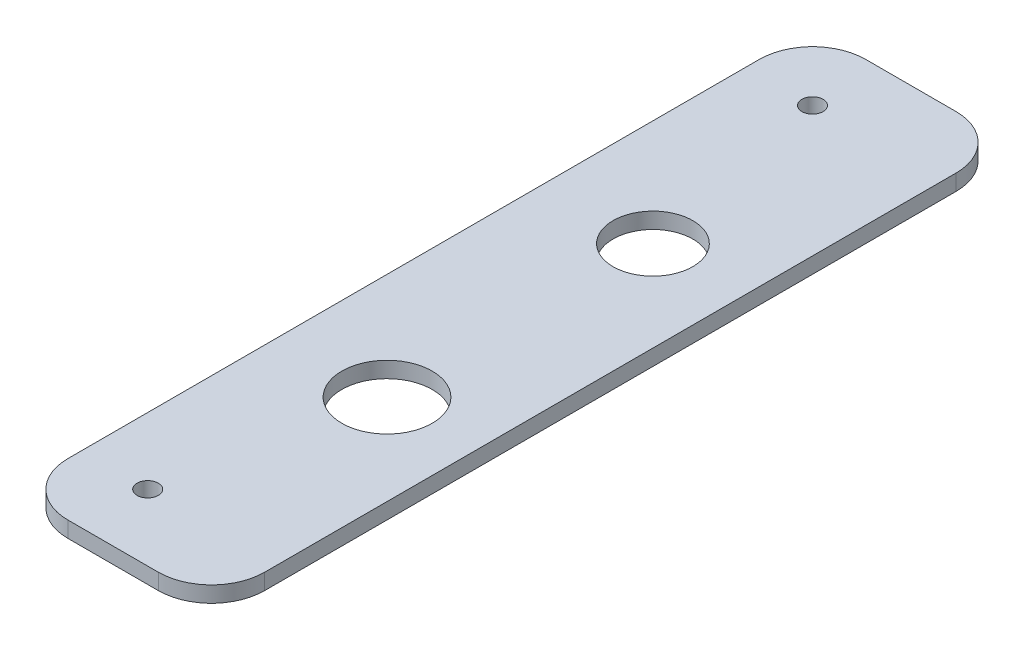
ISO-10303-21;
HEADER;
FILE_DESCRIPTION(('STEP AP214'),'2;1');
FILE_NAME('part.step','',(''),(''),'','','');
FILE_SCHEMA(('AUTOMOTIVE_DESIGN { 1 0 10303 214 1 1 1 1 }'));
ENDSEC;
DATA;
#1=APPLICATION_CONTEXT('core data for automotive mechanical design processes');
#2=APPLICATION_PROTOCOL_DEFINITION('international standard','automotive_design',2000,#1);
#3=PRODUCT_CONTEXT('',#1,'mechanical');
#4=PRODUCT('Part','Part','',(#3));
#5=PRODUCT_RELATED_PRODUCT_CATEGORY('part','',(#4));
#6=PRODUCT_DEFINITION_FORMATION('','',#4);
#7=PRODUCT_DEFINITION_CONTEXT('part definition',#1,'design');
#8=PRODUCT_DEFINITION('design','',#6,#7);
#9=PRODUCT_DEFINITION_SHAPE('','',#8);
#10=(LENGTH_UNIT() NAMED_UNIT(*) SI_UNIT(.MILLI.,.METRE.));
#11=(NAMED_UNIT(*) PLANE_ANGLE_UNIT() SI_UNIT($,.RADIAN.));
#12=(NAMED_UNIT(*) SI_UNIT($,.STERADIAN.) SOLID_ANGLE_UNIT());
#13=UNCERTAINTY_MEASURE_WITH_UNIT(LENGTH_MEASURE(1.E-05),#10,'distance_accuracy_value','');
#14=(GEOMETRIC_REPRESENTATION_CONTEXT(3) GLOBAL_UNCERTAINTY_ASSIGNED_CONTEXT((#13)) GLOBAL_UNIT_ASSIGNED_CONTEXT((#10,
#11,#12)) REPRESENTATION_CONTEXT('',''));
#15=CARTESIAN_POINT('',(0.,0.,0.));
#16=DIRECTION('',(0.,0.,1.));
#17=DIRECTION('',(1.,0.,0.));
#18=AXIS2_PLACEMENT_3D('',#15,#16,#17);
#19=CARTESIAN_POINT('',(0.,3.,0.));
#20=DIRECTION('',(0.,1.,0.));
#21=DIRECTION('',(0.,0.,1.));
#22=AXIS2_PLACEMENT_3D('',#19,#20,#21);
#23=PLANE('',#22);
#24=CARTESIAN_POINT('',(-6.00000000000001,3.,-62.5));
#25=DIRECTION('',(0.,1.,0.));
#26=DIRECTION('',(0.,0.,1.));
#27=AXIS2_PLACEMENT_3D('',#24,#25,#26);
#28=CIRCLE('',#27,2.);
#29=CARTESIAN_POINT('',(-6.00000000000001,3.,-60.5));
#30=VERTEX_POINT('',#29);
#31=EDGE_CURVE('E185',#30,#30,#28,.T.);
#32=ORIENTED_EDGE('',*,*,#31,.F.);
#33=EDGE_LOOP('',(#32));
#34=FACE_BOUND('',#33,.T.);
#35=CARTESIAN_POINT('',(-6.00000000000001,3.,62.5));
#36=DIRECTION('',(0.,1.,0.));
#37=DIRECTION('',(0.,0.,1.));
#38=AXIS2_PLACEMENT_3D('',#35,#36,#37);
#39=CIRCLE('',#38,2.);
#40=CARTESIAN_POINT('',(-6.00000000000001,3.,64.5));
#41=VERTEX_POINT('',#40);
#42=EDGE_CURVE('E193',#41,#41,#39,.T.);
#43=ORIENTED_EDGE('',*,*,#42,.F.);
#44=EDGE_LOOP('',(#43));
#45=FACE_BOUND('',#44,.T.);
#46=CARTESIAN_POINT('',(1.5,3.,-25.));
#47=DIRECTION('',(0.,1.,0.));
#48=DIRECTION('',(0.,0.,1.));
#49=AXIS2_PLACEMENT_3D('',#46,#47,#48);
#50=CIRCLE('',#49,7.5);
#51=CARTESIAN_POINT('',(1.5,3.,-17.5));
#52=VERTEX_POINT('',#51);
#53=EDGE_CURVE('E209',#52,#52,#50,.T.);
#54=ORIENTED_EDGE('',*,*,#53,.F.);
#55=EDGE_LOOP('',(#54));
#56=FACE_BOUND('',#55,.T.);
#57=DIRECTION('',(-1.,0.,0.));
#58=VECTOR('',#57,1.);
#59=CARTESIAN_POINT('',(-18.5,3.,-75.));
#60=LINE('',#59,#58);
#61=CARTESIAN_POINT('',(8.49999999999999,3.,-75.));
#62=VERTEX_POINT('',#61);
#63=CARTESIAN_POINT('',(-8.50000000000001,3.,-75.));
#64=VERTEX_POINT('',#63);
#65=EDGE_CURVE('E219',#62,#64,#60,.T.);
#66=ORIENTED_EDGE('',*,*,#65,.T.);
#67=CARTESIAN_POINT('',(-8.50000000000001,3.,-65.));
#68=DIRECTION('',(0.,1.,0.));
#69=DIRECTION('',(0.,0.,1.));
#70=AXIS2_PLACEMENT_3D('',#67,#68,#69);
#71=CIRCLE('',#70,10.);
#72=CARTESIAN_POINT('',(-18.5,3.,-65.));
#73=VERTEX_POINT('',#72);
#74=EDGE_CURVE('E171',#64,#73,#71,.T.);
#75=ORIENTED_EDGE('',*,*,#74,.T.);
#76=DIRECTION('',(0.,0.,1.));
#77=VECTOR('',#76,1.);
#78=CARTESIAN_POINT('',(-18.5,3.,-75.));
#79=LINE('',#78,#77);
#80=CARTESIAN_POINT('',(-18.5,3.,65.));
#81=VERTEX_POINT('',#80);
#82=EDGE_CURVE('E128',#73,#81,#79,.T.);
#83=ORIENTED_EDGE('',*,*,#82,.T.);
#84=CARTESIAN_POINT('',(-8.49999999999999,3.,65.));
#85=DIRECTION('',(0.,1.,0.));
#86=DIRECTION('',(0.,0.,1.));
#87=AXIS2_PLACEMENT_3D('',#84,#85,#86);
#88=CIRCLE('',#87,10.);
#89=CARTESIAN_POINT('',(-8.49999999999999,3.,75.));
#90=VERTEX_POINT('',#89);
#91=EDGE_CURVE('E63',#81,#90,#88,.T.);
#92=ORIENTED_EDGE('',*,*,#91,.T.);
#93=DIRECTION('',(1.,0.,0.));
#94=VECTOR('',#93,1.);
#95=CARTESIAN_POINT('',(-18.5,3.,75.));
#96=LINE('',#95,#94);
#97=CARTESIAN_POINT('',(8.50000000000001,3.,75.));
#98=VERTEX_POINT('',#97);
#99=EDGE_CURVE('E150',#90,#98,#96,.T.);
#100=ORIENTED_EDGE('',*,*,#99,.T.);
#101=CARTESIAN_POINT('',(8.50000000000001,3.,65.));
#102=DIRECTION('',(0.,1.,0.));
#103=DIRECTION('',(0.,0.,1.));
#104=AXIS2_PLACEMENT_3D('',#101,#102,#103);
#105=CIRCLE('',#104,10.);
#106=CARTESIAN_POINT('',(18.5,3.,65.));
#107=VERTEX_POINT('',#106);
#108=EDGE_CURVE('E163',#98,#107,#105,.T.);
#109=ORIENTED_EDGE('',*,*,#108,.T.);
#110=DIRECTION('',(0.,0.,-1.));
#111=VECTOR('',#110,1.);
#112=CARTESIAN_POINT('',(18.5,3.,-75.));
#113=LINE('',#112,#111);
#114=CARTESIAN_POINT('',(18.5,3.,-65.));
#115=VERTEX_POINT('',#114);
#116=EDGE_CURVE('E143',#107,#115,#113,.T.);
#117=ORIENTED_EDGE('',*,*,#116,.T.);
#118=CARTESIAN_POINT('',(8.49999999999999,3.,-65.));
#119=DIRECTION('',(0.,1.,0.));
#120=DIRECTION('',(0.,0.,1.));
#121=AXIS2_PLACEMENT_3D('',#118,#119,#120);
#122=CIRCLE('',#121,10.);
#123=EDGE_CURVE('E168',#115,#62,#122,.T.);
#124=ORIENTED_EDGE('',*,*,#123,.T.);
#125=EDGE_LOOP('',(#66,#75,#83,#92,#100,#109,#117,#124));
#126=FACE_BOUND('',#125,.T.);
#127=CARTESIAN_POINT('',(1.5,3.,25.));
#128=DIRECTION('',(0.,1.,0.));
#129=DIRECTION('',(0.,0.,1.));
#130=AXIS2_PLACEMENT_3D('',#127,#128,#129);
#131=CIRCLE('',#130,8.5);
#132=CARTESIAN_POINT('',(1.5,3.,33.5));
#133=VERTEX_POINT('',#132);
#134=EDGE_CURVE('E201',#133,#133,#131,.T.);
#135=ORIENTED_EDGE('',*,*,#134,.F.);
#136=EDGE_LOOP('',(#135));
#137=FACE_BOUND('',#136,.T.);
#138=ADVANCED_FACE('F39',(#34,#45,#56,#126,#137),#23,.T.);
#139=CARTESIAN_POINT('',(0.,0.,0.));
#140=DIRECTION('',(0.,1.,0.));
#141=DIRECTION('',(0.,0.,1.));
#142=AXIS2_PLACEMENT_3D('',#139,#140,#141);
#143=PLANE('',#142);
#144=CARTESIAN_POINT('',(-6.00000000000001,0.,-62.5));
#145=DIRECTION('',(0.,1.,0.));
#146=DIRECTION('',(0.,0.,1.));
#147=AXIS2_PLACEMENT_3D('',#144,#145,#146);
#148=CIRCLE('',#147,2.);
#149=CARTESIAN_POINT('',(-6.00000000000001,0.,-60.5));
#150=VERTEX_POINT('',#149);
#151=EDGE_CURVE('E43',#150,#150,#148,.T.);
#152=ORIENTED_EDGE('',*,*,#151,.T.);
#153=EDGE_LOOP('',(#152));
#154=FACE_BOUND('',#153,.T.);
#155=CARTESIAN_POINT('',(-6.00000000000001,0.,62.5));
#156=DIRECTION('',(0.,1.,0.));
#157=DIRECTION('',(0.,0.,1.));
#158=AXIS2_PLACEMENT_3D('',#155,#156,#157);
#159=CIRCLE('',#158,2.);
#160=CARTESIAN_POINT('',(-6.00000000000001,0.,64.5));
#161=VERTEX_POINT('',#160);
#162=EDGE_CURVE('E182',#161,#161,#159,.T.);
#163=ORIENTED_EDGE('',*,*,#162,.T.);
#164=EDGE_LOOP('',(#163));
#165=FACE_BOUND('',#164,.T.);
#166=DIRECTION('',(0.,0.,1.));
#167=VECTOR('',#166,1.);
#168=CARTESIAN_POINT('',(-18.5,0.,-75.));
#169=LINE('',#168,#167);
#170=CARTESIAN_POINT('',(-18.5,0.,-65.));
#171=VERTEX_POINT('',#170);
#172=CARTESIAN_POINT('',(-18.5,0.,65.));
#173=VERTEX_POINT('',#172);
#174=EDGE_CURVE('E126',#171,#173,#169,.T.);
#175=ORIENTED_EDGE('',*,*,#174,.F.);
#176=CARTESIAN_POINT('',(-8.50000000000001,0.,-65.));
#177=DIRECTION('',(0.,1.,0.));
#178=DIRECTION('',(0.,0.,1.));
#179=AXIS2_PLACEMENT_3D('',#176,#177,#178);
#180=CIRCLE('',#179,10.);
#181=CARTESIAN_POINT('',(-8.50000000000001,0.,-75.));
#182=VERTEX_POINT('',#181);
#183=EDGE_CURVE('E108',#171,#182,#180,.F.);
#184=ORIENTED_EDGE('',*,*,#183,.T.);
#185=DIRECTION('',(-1.,0.,0.));
#186=VECTOR('',#185,1.);
#187=CARTESIAN_POINT('',(-18.5,0.,-75.));
#188=LINE('',#187,#186);
#189=CARTESIAN_POINT('',(8.49999999999999,0.,-75.));
#190=VERTEX_POINT('',#189);
#191=EDGE_CURVE('E139',#190,#182,#188,.T.);
#192=ORIENTED_EDGE('',*,*,#191,.F.);
#193=CARTESIAN_POINT('',(8.49999999999999,0.,-65.));
#194=DIRECTION('',(0.,1.,0.));
#195=DIRECTION('',(0.,0.,1.));
#196=AXIS2_PLACEMENT_3D('',#193,#194,#195);
#197=CIRCLE('',#196,10.);
#198=CARTESIAN_POINT('',(18.5,0.,-65.));
#199=VERTEX_POINT('',#198);
#200=EDGE_CURVE('E120',#190,#199,#197,.F.);
#201=ORIENTED_EDGE('',*,*,#200,.T.);
#202=DIRECTION('',(0.,0.,-1.));
#203=VECTOR('',#202,1.);
#204=CARTESIAN_POINT('',(18.5,0.,-75.));
#205=LINE('',#204,#203);
#206=CARTESIAN_POINT('',(18.5,0.,65.));
#207=VERTEX_POINT('',#206);
#208=EDGE_CURVE('E145',#207,#199,#205,.T.);
#209=ORIENTED_EDGE('',*,*,#208,.F.);
#210=CARTESIAN_POINT('',(8.50000000000001,0.,65.));
#211=DIRECTION('',(0.,1.,0.));
#212=DIRECTION('',(0.,0.,1.));
#213=AXIS2_PLACEMENT_3D('',#210,#211,#212);
#214=CIRCLE('',#213,10.);
#215=CARTESIAN_POINT('',(8.50000000000001,0.,75.));
#216=VERTEX_POINT('',#215);
#217=EDGE_CURVE('E130',#207,#216,#214,.F.);
#218=ORIENTED_EDGE('',*,*,#217,.T.);
#219=DIRECTION('',(1.,0.,0.));
#220=VECTOR('',#219,1.);
#221=CARTESIAN_POINT('',(-18.5,0.,75.));
#222=LINE('',#221,#220);
#223=CARTESIAN_POINT('',(-8.49999999999999,0.,75.));
#224=VERTEX_POINT('',#223);
#225=EDGE_CURVE('E138',#224,#216,#222,.T.);
#226=ORIENTED_EDGE('',*,*,#225,.F.);
#227=CARTESIAN_POINT('',(-8.49999999999999,0.,65.));
#228=DIRECTION('',(0.,1.,0.));
#229=DIRECTION('',(0.,0.,1.));
#230=AXIS2_PLACEMENT_3D('',#227,#228,#229);
#231=CIRCLE('',#230,10.);
#232=EDGE_CURVE('E136',#224,#173,#231,.F.);
#233=ORIENTED_EDGE('',*,*,#232,.T.);
#234=EDGE_LOOP('',(#175,#184,#192,#201,#209,#218,#226,#233));
#235=FACE_BOUND('',#234,.T.);
#236=CARTESIAN_POINT('',(1.5,0.,-25.));
#237=DIRECTION('',(0.,1.,0.));
#238=DIRECTION('',(0.,0.,1.));
#239=AXIS2_PLACEMENT_3D('',#236,#237,#238);
#240=CIRCLE('',#239,7.5);
#241=CARTESIAN_POINT('',(1.5,0.,-17.5));
#242=VERTEX_POINT('',#241);
#243=EDGE_CURVE('E205',#242,#242,#240,.T.);
#244=ORIENTED_EDGE('',*,*,#243,.T.);
#245=EDGE_LOOP('',(#244));
#246=FACE_BOUND('',#245,.T.);
#247=CARTESIAN_POINT('',(1.5,0.,25.));
#248=DIRECTION('',(0.,1.,0.));
#249=DIRECTION('',(0.,0.,1.));
#250=AXIS2_PLACEMENT_3D('',#247,#248,#249);
#251=CIRCLE('',#250,8.5);
#252=CARTESIAN_POINT('',(1.5,0.,33.5));
#253=VERTEX_POINT('',#252);
#254=EDGE_CURVE('E191',#253,#253,#251,.T.);
#255=ORIENTED_EDGE('',*,*,#254,.T.);
#256=EDGE_LOOP('',(#255));
#257=FACE_BOUND('',#256,.T.);
#258=ADVANCED_FACE('F133',(#154,#165,#235,#246,#257),#143,.F.);
#259=CARTESIAN_POINT('',(18.5,3.,-75.));
#260=DIRECTION('',(-1.,0.,0.));
#261=DIRECTION('',(0.,0.,1.));
#262=AXIS2_PLACEMENT_3D('',#259,#260,#261);
#263=PLANE('',#262);
#264=ORIENTED_EDGE('',*,*,#208,.T.);
#265=DIRECTION('',(0.,-1.,0.));
#266=VECTOR('',#265,1.);
#267=CARTESIAN_POINT('',(18.5,3.,-65.));
#268=LINE('',#267,#266);
#269=EDGE_CURVE('E178',#199,#115,#268,.F.);
#270=ORIENTED_EDGE('',*,*,#269,.T.);
#271=ORIENTED_EDGE('',*,*,#116,.F.);
#272=DIRECTION('',(0.,-1.,0.));
#273=VECTOR('',#272,1.);
#274=CARTESIAN_POINT('',(18.5,3.,65.));
#275=LINE('',#274,#273);
#276=EDGE_CURVE('E174',#107,#207,#275,.T.);
#277=ORIENTED_EDGE('',*,*,#276,.T.);
#278=EDGE_LOOP('',(#264,#270,#271,#277));
#279=FACE_BOUND('',#278,.T.);
#280=ADVANCED_FACE('F231',(#279),#263,.F.);
#281=CARTESIAN_POINT('',(-18.5,3.,-75.));
#282=DIRECTION('',(0.,0.,1.));
#283=DIRECTION('',(1.,0.,0.));
#284=AXIS2_PLACEMENT_3D('',#281,#282,#283);
#285=PLANE('',#284);
#286=ORIENTED_EDGE('',*,*,#191,.T.);
#287=DIRECTION('',(0.,-1.,0.));
#288=VECTOR('',#287,1.);
#289=CARTESIAN_POINT('',(-8.50000000000001,3.,-75.));
#290=LINE('',#289,#288);
#291=EDGE_CURVE('E113',#182,#64,#290,.F.);
#292=ORIENTED_EDGE('',*,*,#291,.T.);
#293=ORIENTED_EDGE('',*,*,#65,.F.);
#294=DIRECTION('',(0.,-1.,0.));
#295=VECTOR('',#294,1.);
#296=CARTESIAN_POINT('',(8.49999999999999,3.,-75.));
#297=LINE('',#296,#295);
#298=EDGE_CURVE('E119',#62,#190,#297,.T.);
#299=ORIENTED_EDGE('',*,*,#298,.T.);
#300=EDGE_LOOP('',(#286,#292,#293,#299));
#301=FACE_BOUND('',#300,.T.);
#302=ADVANCED_FACE('F241',(#301),#285,.F.);
#303=CARTESIAN_POINT('',(-18.5,3.,-75.));
#304=DIRECTION('',(1.,0.,0.));
#305=DIRECTION('',(0.,0.,-1.));
#306=AXIS2_PLACEMENT_3D('',#303,#304,#305);
#307=PLANE('',#306);
#308=ORIENTED_EDGE('',*,*,#82,.F.);
#309=DIRECTION('',(0.,-1.,0.));
#310=VECTOR('',#309,1.);
#311=CARTESIAN_POINT('',(-18.5,3.,-65.));
#312=LINE('',#311,#310);
#313=EDGE_CURVE('E112',#73,#171,#312,.T.);
#314=ORIENTED_EDGE('',*,*,#313,.T.);
#315=ORIENTED_EDGE('',*,*,#174,.T.);
#316=DIRECTION('',(0.,-1.,0.));
#317=VECTOR('',#316,1.);
#318=CARTESIAN_POINT('',(-18.5,3.,65.));
#319=LINE('',#318,#317);
#320=EDGE_CURVE('E131',#173,#81,#319,.F.);
#321=ORIENTED_EDGE('',*,*,#320,.T.);
#322=EDGE_LOOP('',(#308,#314,#315,#321));
#323=FACE_BOUND('',#322,.T.);
#324=ADVANCED_FACE('F125',(#323),#307,.F.);
#325=CARTESIAN_POINT('',(-18.5,3.,75.));
#326=DIRECTION('',(0.,0.,-1.));
#327=DIRECTION('',(-1.,0.,0.));
#328=AXIS2_PLACEMENT_3D('',#325,#326,#327);
#329=PLANE('',#328);
#330=ORIENTED_EDGE('',*,*,#99,.F.);
#331=DIRECTION('',(0.,-1.,0.));
#332=VECTOR('',#331,1.);
#333=CARTESIAN_POINT('',(-8.49999999999999,3.,75.));
#334=LINE('',#333,#332);
#335=EDGE_CURVE('E11',#90,#224,#334,.T.);
#336=ORIENTED_EDGE('',*,*,#335,.T.);
#337=ORIENTED_EDGE('',*,*,#225,.T.);
#338=DIRECTION('',(0.,-1.,0.));
#339=VECTOR('',#338,1.);
#340=CARTESIAN_POINT('',(8.50000000000001,3.,75.));
#341=LINE('',#340,#339);
#342=EDGE_CURVE('E49',#216,#98,#341,.F.);
#343=ORIENTED_EDGE('',*,*,#342,.T.);
#344=EDGE_LOOP('',(#330,#336,#337,#343));
#345=FACE_BOUND('',#344,.T.);
#346=ADVANCED_FACE('F248',(#345),#329,.F.);
#347=CARTESIAN_POINT('',(1.5,3.,-25.));
#348=DIRECTION('',(0.,-1.,0.));
#349=DIRECTION('',(0.,0.,-1.));
#350=AXIS2_PLACEMENT_3D('',#347,#348,#349);
#351=CYLINDRICAL_SURFACE('',#350,7.5);
#352=ORIENTED_EDGE('',*,*,#53,.T.);
#353=EDGE_LOOP('',(#352));
#354=FACE_BOUND('',#353,.T.);
#355=ORIENTED_EDGE('',*,*,#243,.F.);
#356=EDGE_LOOP('',(#355));
#357=FACE_BOUND('',#356,.T.);
#358=ADVANCED_FACE('F261',(#354,#357),#351,.F.);
#359=CARTESIAN_POINT('',(1.5,3.,25.));
#360=DIRECTION('',(0.,-1.,0.));
#361=DIRECTION('',(0.,0.,-1.));
#362=AXIS2_PLACEMENT_3D('',#359,#360,#361);
#363=CYLINDRICAL_SURFACE('',#362,8.5);
#364=ORIENTED_EDGE('',*,*,#134,.T.);
#365=EDGE_LOOP('',(#364));
#366=FACE_BOUND('',#365,.T.);
#367=ORIENTED_EDGE('',*,*,#254,.F.);
#368=EDGE_LOOP('',(#367));
#369=FACE_BOUND('',#368,.T.);
#370=ADVANCED_FACE('F268',(#366,#369),#363,.F.);
#371=CARTESIAN_POINT('',(-8.50000000000001,3.,-65.));
#372=DIRECTION('',(0.,-1.,0.));
#373=DIRECTION('',(0.,0.,-1.));
#374=AXIS2_PLACEMENT_3D('',#371,#372,#373);
#375=CYLINDRICAL_SURFACE('',#374,10.);
#376=ORIENTED_EDGE('',*,*,#74,.F.);
#377=ORIENTED_EDGE('',*,*,#291,.F.);
#378=ORIENTED_EDGE('',*,*,#183,.F.);
#379=ORIENTED_EDGE('',*,*,#313,.F.);
#380=EDGE_LOOP('',(#376,#377,#378,#379));
#381=FACE_BOUND('',#380,.T.);
#382=ADVANCED_FACE('F111',(#381),#375,.T.);
#383=CARTESIAN_POINT('',(8.49999999999999,3.,-65.));
#384=DIRECTION('',(0.,-1.,0.));
#385=DIRECTION('',(0.,0.,-1.));
#386=AXIS2_PLACEMENT_3D('',#383,#384,#385);
#387=CYLINDRICAL_SURFACE('',#386,10.);
#388=ORIENTED_EDGE('',*,*,#123,.F.);
#389=ORIENTED_EDGE('',*,*,#269,.F.);
#390=ORIENTED_EDGE('',*,*,#200,.F.);
#391=ORIENTED_EDGE('',*,*,#298,.F.);
#392=EDGE_LOOP('',(#388,#389,#390,#391));
#393=FACE_BOUND('',#392,.T.);
#394=ADVANCED_FACE('F236',(#393),#387,.T.);
#395=CARTESIAN_POINT('',(-8.49999999999999,3.,65.));
#396=DIRECTION('',(0.,-1.,0.));
#397=DIRECTION('',(0.,0.,-1.));
#398=AXIS2_PLACEMENT_3D('',#395,#396,#397);
#399=CYLINDRICAL_SURFACE('',#398,10.);
#400=ORIENTED_EDGE('',*,*,#91,.F.);
#401=ORIENTED_EDGE('',*,*,#320,.F.);
#402=ORIENTED_EDGE('',*,*,#232,.F.);
#403=ORIENTED_EDGE('',*,*,#335,.F.);
#404=EDGE_LOOP('',(#400,#401,#402,#403));
#405=FACE_BOUND('',#404,.T.);
#406=ADVANCED_FACE('F273',(#405),#399,.T.);
#407=CARTESIAN_POINT('',(8.50000000000001,3.,65.));
#408=DIRECTION('',(0.,-1.,0.));
#409=DIRECTION('',(0.,0.,-1.));
#410=AXIS2_PLACEMENT_3D('',#407,#408,#409);
#411=CYLINDRICAL_SURFACE('',#410,10.);
#412=ORIENTED_EDGE('',*,*,#108,.F.);
#413=ORIENTED_EDGE('',*,*,#342,.F.);
#414=ORIENTED_EDGE('',*,*,#217,.F.);
#415=ORIENTED_EDGE('',*,*,#276,.F.);
#416=EDGE_LOOP('',(#412,#413,#414,#415));
#417=FACE_BOUND('',#416,.T.);
#418=ADVANCED_FACE('F41',(#417),#411,.T.);
#419=CARTESIAN_POINT('',(-6.00000000000001,-7.,62.5));
#420=DIRECTION('',(0.,1.,0.));
#421=DIRECTION('',(0.,0.,1.));
#422=AXIS2_PLACEMENT_3D('',#419,#420,#421);
#423=CYLINDRICAL_SURFACE('',#422,2.);
#424=ORIENTED_EDGE('',*,*,#42,.T.);
#425=EDGE_LOOP('',(#424));
#426=FACE_BOUND('',#425,.T.);
#427=ORIENTED_EDGE('',*,*,#162,.F.);
#428=EDGE_LOOP('',(#427));
#429=FACE_BOUND('',#428,.T.);
#430=ADVANCED_FACE('F279',(#426,#429),#423,.F.);
#431=CARTESIAN_POINT('',(-6.00000000000001,-7.,-62.5));
#432=DIRECTION('',(0.,1.,0.));
#433=DIRECTION('',(0.,0.,1.));
#434=AXIS2_PLACEMENT_3D('',#431,#432,#433);
#435=CYLINDRICAL_SURFACE('',#434,2.);
#436=ORIENTED_EDGE('',*,*,#31,.T.);
#437=EDGE_LOOP('',(#436));
#438=FACE_BOUND('',#437,.T.);
#439=ORIENTED_EDGE('',*,*,#151,.F.);
#440=EDGE_LOOP('',(#439));
#441=FACE_BOUND('',#440,.T.);
#442=ADVANCED_FACE('F294',(#438,#441),#435,.F.);
#443=CLOSED_SHELL('',(#138,#258,#280,#302,#324,#346,#358,#370,#382,#394,#406,#418,#430,#442));
#444=MANIFOLD_SOLID_BREP('B2',#443);
#445=ADVANCED_BREP_SHAPE_REPRESENTATION('',(#18,#444),#14);
#446=SHAPE_DEFINITION_REPRESENTATION(#9,#445);
ENDSEC;
END-ISO-10303-21;
